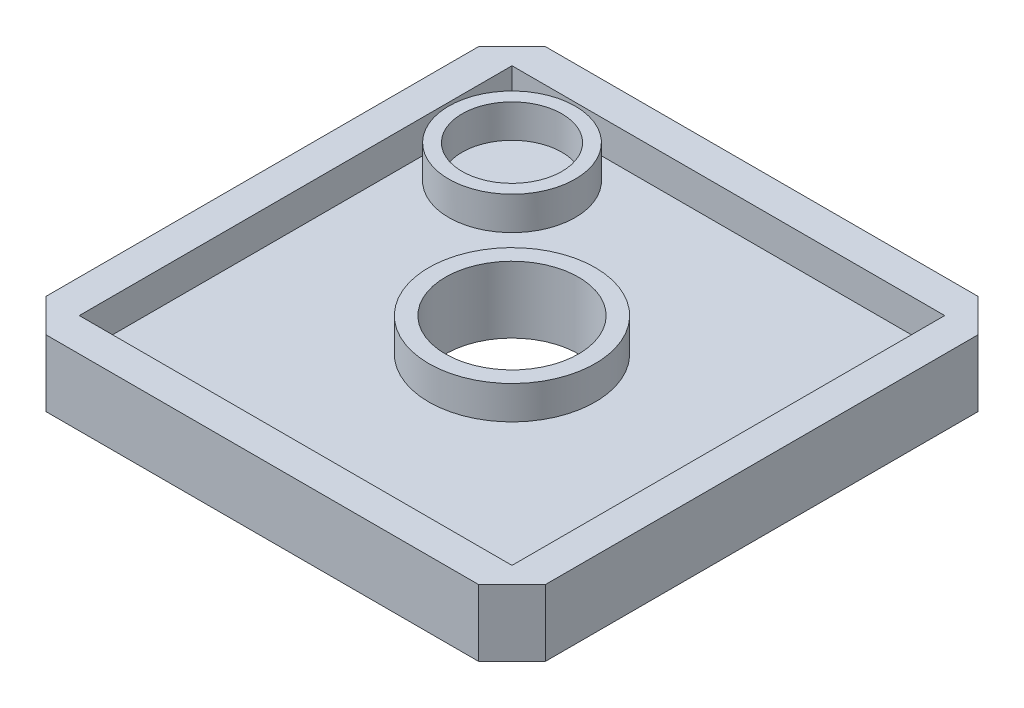
ISO-10303-21;
HEADER;
FILE_DESCRIPTION(('STEP AP214'),'2;1');
FILE_NAME('part.step','',(''),(''),'','','');
FILE_SCHEMA(('AUTOMOTIVE_DESIGN { 1 0 10303 214 1 1 1 1 }'));
ENDSEC;
DATA;
#1=APPLICATION_CONTEXT('core data for automotive mechanical design processes');
#2=APPLICATION_PROTOCOL_DEFINITION('international standard','automotive_design',2000,#1);
#3=PRODUCT_CONTEXT('',#1,'mechanical');
#4=PRODUCT('Part','Part','',(#3));
#5=PRODUCT_RELATED_PRODUCT_CATEGORY('part','',(#4));
#6=PRODUCT_DEFINITION_FORMATION('','',#4);
#7=PRODUCT_DEFINITION_CONTEXT('part definition',#1,'design');
#8=PRODUCT_DEFINITION('design','',#6,#7);
#9=PRODUCT_DEFINITION_SHAPE('','',#8);
#10=(LENGTH_UNIT() NAMED_UNIT(*) SI_UNIT(.MILLI.,.METRE.));
#11=(NAMED_UNIT(*) PLANE_ANGLE_UNIT() SI_UNIT($,.RADIAN.));
#12=(NAMED_UNIT(*) SI_UNIT($,.STERADIAN.) SOLID_ANGLE_UNIT());
#13=UNCERTAINTY_MEASURE_WITH_UNIT(LENGTH_MEASURE(1.E-05),#10,'distance_accuracy_value','');
#14=(GEOMETRIC_REPRESENTATION_CONTEXT(3) GLOBAL_UNCERTAINTY_ASSIGNED_CONTEXT((#13)) GLOBAL_UNIT_ASSIGNED_CONTEXT((#10,
#11,#12)) REPRESENTATION_CONTEXT('',''));
#15=CARTESIAN_POINT('',(0.,0.,0.));
#16=DIRECTION('',(0.,0.,1.));
#17=DIRECTION('',(1.,0.,0.));
#18=AXIS2_PLACEMENT_3D('',#15,#16,#17);
#19=CARTESIAN_POINT('',(0.,20.,0.));
#20=DIRECTION('',(0.,-1.,0.));
#21=DIRECTION('',(0.,0.,-1.));
#22=AXIS2_PLACEMENT_3D('',#19,#20,#21);
#23=PLANE('',#22);
#24=DIRECTION('',(0.,0.,-1.));
#25=VECTOR('',#24,1.);
#26=CARTESIAN_POINT('',(75.,20.,75.));
#27=LINE('',#26,#25);
#28=CARTESIAN_POINT('',(75.,20.,65.));
#29=VERTEX_POINT('',#28);
#30=CARTESIAN_POINT('',(75.,20.,-65.));
#31=VERTEX_POINT('',#30);
#32=EDGE_CURVE('E175',#29,#31,#27,.T.);
#33=ORIENTED_EDGE('',*,*,#32,.T.);
#34=DIRECTION('',(0.707106781186548,0.,0.707106781186547));
#35=VECTOR('',#34,1.);
#36=CARTESIAN_POINT('',(65.,20.,-75.));
#37=LINE('',#36,#35);
#38=CARTESIAN_POINT('',(65.,20.,-75.));
#39=VERTEX_POINT('',#38);
#40=EDGE_CURVE('E218',#31,#39,#37,.F.);
#41=ORIENTED_EDGE('',*,*,#40,.T.);
#42=DIRECTION('',(-1.,0.,0.));
#43=VECTOR('',#42,1.);
#44=CARTESIAN_POINT('',(-75.,20.,-75.));
#45=LINE('',#44,#43);
#46=CARTESIAN_POINT('',(-64.9999999999999,20.,-75.));
#47=VERTEX_POINT('',#46);
#48=EDGE_CURVE('E178',#39,#47,#45,.T.);
#49=ORIENTED_EDGE('',*,*,#48,.T.);
#50=DIRECTION('',(0.707106781186547,0.,-0.707106781186548));
#51=VECTOR('',#50,1.);
#52=CARTESIAN_POINT('',(-75.,20.,-65.));
#53=LINE('',#52,#51);
#54=CARTESIAN_POINT('',(-75.,20.,-65.));
#55=VERTEX_POINT('',#54);
#56=EDGE_CURVE('E216',#47,#55,#53,.F.);
#57=ORIENTED_EDGE('',*,*,#56,.T.);
#58=DIRECTION('',(0.,0.,1.));
#59=VECTOR('',#58,1.);
#60=CARTESIAN_POINT('',(-75.,20.,75.));
#61=LINE('',#60,#59);
#62=CARTESIAN_POINT('',(-75.,20.,65.));
#63=VERTEX_POINT('',#62);
#64=EDGE_CURVE('E182',#55,#63,#61,.T.);
#65=ORIENTED_EDGE('',*,*,#64,.T.);
#66=DIRECTION('',(-0.707106781186548,0.,-0.707106781186548));
#67=VECTOR('',#66,1.);
#68=CARTESIAN_POINT('',(-64.9999999999999,20.,75.));
#69=LINE('',#68,#67);
#70=CARTESIAN_POINT('',(-64.9999999999999,20.,75.));
#71=VERTEX_POINT('',#70);
#72=EDGE_CURVE('E63',#63,#71,#69,.F.);
#73=ORIENTED_EDGE('',*,*,#72,.T.);
#74=DIRECTION('',(1.,0.,0.));
#75=VECTOR('',#74,1.);
#76=CARTESIAN_POINT('',(-75.,20.,75.));
#77=LINE('',#76,#75);
#78=CARTESIAN_POINT('',(65.,20.,75.));
#79=VERTEX_POINT('',#78);
#80=EDGE_CURVE('E184',#71,#79,#77,.T.);
#81=ORIENTED_EDGE('',*,*,#80,.T.);
#82=DIRECTION('',(-0.707106781186548,0.,0.707106781186548));
#83=VECTOR('',#82,1.);
#84=CARTESIAN_POINT('',(75.,20.,65.));
#85=LINE('',#84,#83);
#86=EDGE_CURVE('E213',#79,#29,#85,.F.);
#87=ORIENTED_EDGE('',*,*,#86,.T.);
#88=EDGE_LOOP('',(#33,#41,#49,#57,#65,#73,#81,#87));
#89=FACE_BOUND('',#88,.T.);
#90=DIRECTION('',(0.,0.,1.));
#91=VECTOR('',#90,1.);
#92=CARTESIAN_POINT('',(-65.,20.,65.));
#93=LINE('',#92,#91);
#94=CARTESIAN_POINT('',(-65.,20.,-65.));
#95=VERTEX_POINT('',#94);
#96=CARTESIAN_POINT('',(-65.,20.,65.));
#97=VERTEX_POINT('',#96);
#98=EDGE_CURVE('E157',#95,#97,#93,.T.);
#99=ORIENTED_EDGE('',*,*,#98,.F.);
#100=DIRECTION('',(-1.,0.,0.));
#101=VECTOR('',#100,1.);
#102=CARTESIAN_POINT('',(-65.,20.,-65.));
#103=LINE('',#102,#101);
#104=CARTESIAN_POINT('',(65.,20.,-65.));
#105=VERTEX_POINT('',#104);
#106=EDGE_CURVE('E138',#105,#95,#103,.T.);
#107=ORIENTED_EDGE('',*,*,#106,.F.);
#108=DIRECTION('',(0.,0.,-1.));
#109=VECTOR('',#108,1.);
#110=CARTESIAN_POINT('',(65.0000000000001,20.,65.));
#111=LINE('',#110,#109);
#112=CARTESIAN_POINT('',(65.0000000000001,20.,65.));
#113=VERTEX_POINT('',#112);
#114=EDGE_CURVE('E165',#113,#105,#111,.T.);
#115=ORIENTED_EDGE('',*,*,#114,.F.);
#116=DIRECTION('',(1.,0.,0.));
#117=VECTOR('',#116,1.);
#118=CARTESIAN_POINT('',(-65.,20.,65.));
#119=LINE('',#118,#117);
#120=EDGE_CURVE('E159',#97,#113,#119,.T.);
#121=ORIENTED_EDGE('',*,*,#120,.F.);
#122=EDGE_LOOP('',(#99,#107,#115,#121));
#123=FACE_BOUND('',#122,.T.);
#124=ADVANCED_FACE('F40',(#89,#123),#23,.F.);
#125=CARTESIAN_POINT('',(0.,0.,0.));
#126=DIRECTION('',(0.,-1.,0.));
#127=DIRECTION('',(0.,0.,-1.));
#128=AXIS2_PLACEMENT_3D('',#125,#126,#127);
#129=PLANE('',#128);
#130=CARTESIAN_POINT('',(0.,0.,0.));
#131=DIRECTION('',(0.,1.,0.));
#132=DIRECTION('',(0.,0.,1.));
#133=AXIS2_PLACEMENT_3D('',#130,#131,#132);
#134=CIRCLE('',#133,20.);
#135=CARTESIAN_POINT('',(0.,0.,20.));
#136=VERTEX_POINT('',#135);
#137=EDGE_CURVE('E152',#136,#136,#134,.T.);
#138=ORIENTED_EDGE('',*,*,#137,.T.);
#139=EDGE_LOOP('',(#138));
#140=FACE_BOUND('',#139,.T.);
#141=DIRECTION('',(-1.,0.,0.));
#142=VECTOR('',#141,1.);
#143=CARTESIAN_POINT('',(-75.,0.,-75.));
#144=LINE('',#143,#142);
#145=CARTESIAN_POINT('',(65.,0.,-75.));
#146=VERTEX_POINT('',#145);
#147=CARTESIAN_POINT('',(-64.9999999999999,0.,-75.));
#148=VERTEX_POINT('',#147);
#149=EDGE_CURVE('E189',#146,#148,#144,.T.);
#150=ORIENTED_EDGE('',*,*,#149,.F.);
#151=DIRECTION('',(-0.707106781186548,0.,-0.707106781186547));
#152=VECTOR('',#151,1.);
#153=CARTESIAN_POINT('',(70.,0.,-70.0000000000001));
#154=LINE('',#153,#152);
#155=CARTESIAN_POINT('',(75.,0.,-65.));
#156=VERTEX_POINT('',#155);
#157=EDGE_CURVE('E206',#146,#156,#154,.F.);
#158=ORIENTED_EDGE('',*,*,#157,.T.);
#159=DIRECTION('',(0.,0.,-1.));
#160=VECTOR('',#159,1.);
#161=CARTESIAN_POINT('',(75.,0.,75.));
#162=LINE('',#161,#160);
#163=CARTESIAN_POINT('',(75.,0.,65.));
#164=VERTEX_POINT('',#163);
#165=EDGE_CURVE('E174',#164,#156,#162,.T.);
#166=ORIENTED_EDGE('',*,*,#165,.F.);
#167=DIRECTION('',(0.707106781186548,0.,-0.707106781186548));
#168=VECTOR('',#167,1.);
#169=CARTESIAN_POINT('',(70.,0.,70.));
#170=LINE('',#169,#168);
#171=CARTESIAN_POINT('',(65.,0.,75.));
#172=VERTEX_POINT('',#171);
#173=EDGE_CURVE('E200',#164,#172,#170,.F.);
#174=ORIENTED_EDGE('',*,*,#173,.T.);
#175=DIRECTION('',(1.,0.,0.));
#176=VECTOR('',#175,1.);
#177=CARTESIAN_POINT('',(-75.,0.,75.));
#178=LINE('',#177,#176);
#179=CARTESIAN_POINT('',(-64.9999999999999,0.,75.));
#180=VERTEX_POINT('',#179);
#181=EDGE_CURVE('E179',#180,#172,#178,.T.);
#182=ORIENTED_EDGE('',*,*,#181,.F.);
#183=DIRECTION('',(0.707106781186548,0.,0.707106781186548));
#184=VECTOR('',#183,1.);
#185=CARTESIAN_POINT('',(-70.,0.,70.));
#186=LINE('',#185,#184);
#187=CARTESIAN_POINT('',(-75.,0.,65.));
#188=VERTEX_POINT('',#187);
#189=EDGE_CURVE('E202',#180,#188,#186,.F.);
#190=ORIENTED_EDGE('',*,*,#189,.T.);
#191=DIRECTION('',(0.,0.,1.));
#192=VECTOR('',#191,1.);
#193=CARTESIAN_POINT('',(-75.,0.,75.));
#194=LINE('',#193,#192);
#195=CARTESIAN_POINT('',(-75.,0.,-65.));
#196=VERTEX_POINT('',#195);
#197=EDGE_CURVE('E192',#196,#188,#194,.T.);
#198=ORIENTED_EDGE('',*,*,#197,.F.);
#199=DIRECTION('',(-0.707106781186547,0.,0.707106781186548));
#200=VECTOR('',#199,1.);
#201=CARTESIAN_POINT('',(-70.,0.,-69.9999999999999));
#202=LINE('',#201,#200);
#203=EDGE_CURVE('E204',#196,#148,#202,.F.);
#204=ORIENTED_EDGE('',*,*,#203,.T.);
#205=EDGE_LOOP('',(#150,#158,#166,#174,#182,#190,#198,#204));
#206=FACE_BOUND('',#205,.T.);
#207=ADVANCED_FACE('F232',(#140,#206),#129,.T.);
#208=CARTESIAN_POINT('',(75.,20.,75.));
#209=DIRECTION('',(-1.,0.,0.));
#210=DIRECTION('',(0.,0.,1.));
#211=AXIS2_PLACEMENT_3D('',#208,#209,#210);
#212=PLANE('',#211);
#213=ORIENTED_EDGE('',*,*,#165,.T.);
#214=DIRECTION('',(0.,1.,0.));
#215=VECTOR('',#214,1.);
#216=CARTESIAN_POINT('',(75.,20.,-65.));
#217=LINE('',#216,#215);
#218=EDGE_CURVE('E211',#156,#31,#217,.T.);
#219=ORIENTED_EDGE('',*,*,#218,.T.);
#220=ORIENTED_EDGE('',*,*,#32,.F.);
#221=DIRECTION('',(0.,-1.,0.));
#222=VECTOR('',#221,1.);
#223=CARTESIAN_POINT('',(75.,20.,65.));
#224=LINE('',#223,#222);
#225=EDGE_CURVE('E208',#29,#164,#224,.T.);
#226=ORIENTED_EDGE('',*,*,#225,.T.);
#227=EDGE_LOOP('',(#213,#219,#220,#226));
#228=FACE_BOUND('',#227,.T.);
#229=ADVANCED_FACE('F240',(#228),#212,.F.);
#230=CARTESIAN_POINT('',(-75.,20.,-75.));
#231=DIRECTION('',(0.,0.,1.));
#232=DIRECTION('',(1.,0.,0.));
#233=AXIS2_PLACEMENT_3D('',#230,#231,#232);
#234=PLANE('',#233);
#235=ORIENTED_EDGE('',*,*,#48,.F.);
#236=DIRECTION('',(0.,-1.,0.));
#237=VECTOR('',#236,1.);
#238=CARTESIAN_POINT('',(65.,20.,-75.));
#239=LINE('',#238,#237);
#240=EDGE_CURVE('E197',#39,#146,#239,.T.);
#241=ORIENTED_EDGE('',*,*,#240,.T.);
#242=ORIENTED_EDGE('',*,*,#149,.T.);
#243=DIRECTION('',(0.,1.,0.));
#244=VECTOR('',#243,1.);
#245=CARTESIAN_POINT('',(-64.9999999999999,20.,-75.));
#246=LINE('',#245,#244);
#247=EDGE_CURVE('E186',#148,#47,#246,.T.);
#248=ORIENTED_EDGE('',*,*,#247,.T.);
#249=EDGE_LOOP('',(#235,#241,#242,#248));
#250=FACE_BOUND('',#249,.T.);
#251=ADVANCED_FACE('F249',(#250),#234,.F.);
#252=CARTESIAN_POINT('',(-75.,20.,75.));
#253=DIRECTION('',(1.,0.,0.));
#254=DIRECTION('',(0.,0.,-1.));
#255=AXIS2_PLACEMENT_3D('',#252,#253,#254);
#256=PLANE('',#255);
#257=ORIENTED_EDGE('',*,*,#64,.F.);
#258=DIRECTION('',(0.,-1.,0.));
#259=VECTOR('',#258,1.);
#260=CARTESIAN_POINT('',(-75.,20.,-65.));
#261=LINE('',#260,#259);
#262=EDGE_CURVE('E222',#55,#196,#261,.T.);
#263=ORIENTED_EDGE('',*,*,#262,.T.);
#264=ORIENTED_EDGE('',*,*,#197,.T.);
#265=DIRECTION('',(0.,1.,0.));
#266=VECTOR('',#265,1.);
#267=CARTESIAN_POINT('',(-75.,20.,65.));
#268=LINE('',#267,#266);
#269=EDGE_CURVE('E220',#188,#63,#268,.T.);
#270=ORIENTED_EDGE('',*,*,#269,.T.);
#271=EDGE_LOOP('',(#257,#263,#264,#270));
#272=FACE_BOUND('',#271,.T.);
#273=ADVANCED_FACE('F257',(#272),#256,.F.);
#274=CARTESIAN_POINT('',(-75.,20.,75.));
#275=DIRECTION('',(0.,0.,-1.));
#276=DIRECTION('',(-1.,0.,0.));
#277=AXIS2_PLACEMENT_3D('',#274,#275,#276);
#278=PLANE('',#277);
#279=ORIENTED_EDGE('',*,*,#80,.F.);
#280=DIRECTION('',(0.,-1.,0.));
#281=VECTOR('',#280,1.);
#282=CARTESIAN_POINT('',(-64.9999999999999,20.,75.));
#283=LINE('',#282,#281);
#284=EDGE_CURVE('E49',#71,#180,#283,.T.);
#285=ORIENTED_EDGE('',*,*,#284,.T.);
#286=ORIENTED_EDGE('',*,*,#181,.T.);
#287=DIRECTION('',(0.,1.,0.));
#288=VECTOR('',#287,1.);
#289=CARTESIAN_POINT('',(65.,20.,75.));
#290=LINE('',#289,#288);
#291=EDGE_CURVE('E56',#172,#79,#290,.T.);
#292=ORIENTED_EDGE('',*,*,#291,.T.);
#293=EDGE_LOOP('',(#279,#285,#286,#292));
#294=FACE_BOUND('',#293,.T.);
#295=ADVANCED_FACE('F228',(#294),#278,.F.);
#296=CARTESIAN_POINT('',(-65.,20.,65.));
#297=DIRECTION('',(1.,0.,0.));
#298=DIRECTION('',(0.,0.,-1.));
#299=AXIS2_PLACEMENT_3D('',#296,#297,#298);
#300=PLANE('',#299);
#301=DIRECTION('',(0.,0.,-1.));
#302=VECTOR('',#301,1.);
#303=CARTESIAN_POINT('',(-65.,10.,0.));
#304=LINE('',#303,#302);
#305=CARTESIAN_POINT('',(-65.,10.,65.));
#306=VERTEX_POINT('',#305);
#307=CARTESIAN_POINT('',(-65.,10.,-65.));
#308=VERTEX_POINT('',#307);
#309=EDGE_CURVE('E145',#306,#308,#304,.T.);
#310=ORIENTED_EDGE('',*,*,#309,.T.);
#311=DIRECTION('',(0.,-1.,0.));
#312=VECTOR('',#311,1.);
#313=CARTESIAN_POINT('',(-65.,20.,-65.));
#314=LINE('',#313,#312);
#315=EDGE_CURVE('E131',#95,#308,#314,.T.);
#316=ORIENTED_EDGE('',*,*,#315,.F.);
#317=ORIENTED_EDGE('',*,*,#98,.T.);
#318=DIRECTION('',(0.,-1.,0.));
#319=VECTOR('',#318,1.);
#320=CARTESIAN_POINT('',(-65.,20.,65.));
#321=LINE('',#320,#319);
#322=EDGE_CURVE('E148',#97,#306,#321,.T.);
#323=ORIENTED_EDGE('',*,*,#322,.T.);
#324=EDGE_LOOP('',(#310,#316,#317,#323));
#325=FACE_BOUND('',#324,.T.);
#326=ADVANCED_FACE('F146',(#325),#300,.T.);
#327=CARTESIAN_POINT('',(-65.,20.,65.));
#328=DIRECTION('',(0.,0.,-1.));
#329=DIRECTION('',(-1.,0.,0.));
#330=AXIS2_PLACEMENT_3D('',#327,#328,#329);
#331=PLANE('',#330);
#332=DIRECTION('',(1.,0.,0.));
#333=VECTOR('',#332,1.);
#334=CARTESIAN_POINT('',(0.,10.,65.));
#335=LINE('',#334,#333);
#336=CARTESIAN_POINT('',(65.0000000000001,10.,65.));
#337=VERTEX_POINT('',#336);
#338=EDGE_CURVE('E151',#306,#337,#335,.T.);
#339=ORIENTED_EDGE('',*,*,#338,.F.);
#340=ORIENTED_EDGE('',*,*,#322,.F.);
#341=ORIENTED_EDGE('',*,*,#120,.T.);
#342=DIRECTION('',(0.,-1.,0.));
#343=VECTOR('',#342,1.);
#344=CARTESIAN_POINT('',(65.0000000000001,20.,65.));
#345=LINE('',#344,#343);
#346=EDGE_CURVE('E170',#113,#337,#345,.T.);
#347=ORIENTED_EDGE('',*,*,#346,.T.);
#348=EDGE_LOOP('',(#339,#340,#341,#347));
#349=FACE_BOUND('',#348,.T.);
#350=ADVANCED_FACE('F362',(#349),#331,.T.);
#351=CARTESIAN_POINT('',(65.0000000000001,20.,65.));
#352=DIRECTION('',(-1.,0.,0.));
#353=DIRECTION('',(0.,0.,1.));
#354=AXIS2_PLACEMENT_3D('',#351,#352,#353);
#355=PLANE('',#354);
#356=DIRECTION('',(0.,0.,-1.));
#357=VECTOR('',#356,1.);
#358=CARTESIAN_POINT('',(65.0000000000001,10.,0.));
#359=LINE('',#358,#357);
#360=CARTESIAN_POINT('',(65.,10.,-65.));
#361=VERTEX_POINT('',#360);
#362=EDGE_CURVE('E156',#337,#361,#359,.T.);
#363=ORIENTED_EDGE('',*,*,#362,.F.);
#364=ORIENTED_EDGE('',*,*,#346,.F.);
#365=ORIENTED_EDGE('',*,*,#114,.T.);
#366=DIRECTION('',(0.,-1.,0.));
#367=VECTOR('',#366,1.);
#368=CARTESIAN_POINT('',(65.,20.,-65.));
#369=LINE('',#368,#367);
#370=EDGE_CURVE('E141',#105,#361,#369,.T.);
#371=ORIENTED_EDGE('',*,*,#370,.T.);
#372=EDGE_LOOP('',(#363,#364,#365,#371));
#373=FACE_BOUND('',#372,.T.);
#374=ADVANCED_FACE('F306',(#373),#355,.T.);
#375=CARTESIAN_POINT('',(-65.,20.,-65.));
#376=DIRECTION('',(0.,0.,1.));
#377=DIRECTION('',(1.,0.,0.));
#378=AXIS2_PLACEMENT_3D('',#375,#376,#377);
#379=PLANE('',#378);
#380=DIRECTION('',(1.,0.,0.));
#381=VECTOR('',#380,1.);
#382=CARTESIAN_POINT('',(0.,10.,-65.));
#383=LINE('',#382,#381);
#384=EDGE_CURVE('E135',#308,#361,#383,.T.);
#385=ORIENTED_EDGE('',*,*,#384,.T.);
#386=ORIENTED_EDGE('',*,*,#370,.F.);
#387=ORIENTED_EDGE('',*,*,#106,.T.);
#388=ORIENTED_EDGE('',*,*,#315,.T.);
#389=EDGE_LOOP('',(#385,#386,#387,#388));
#390=FACE_BOUND('',#389,.T.);
#391=ADVANCED_FACE('F133',(#390),#379,.T.);
#392=CARTESIAN_POINT('',(0.,10.,0.));
#393=DIRECTION('',(0.,1.,0.));
#394=DIRECTION('',(0.,0.,1.));
#395=AXIS2_PLACEMENT_3D('',#392,#393,#394);
#396=PLANE('',#395);
#397=CARTESIAN_POINT('',(-45.,10.,-45.));
#398=DIRECTION('',(0.,1.,0.));
#399=DIRECTION('',(0.,0.,1.));
#400=AXIS2_PLACEMENT_3D('',#397,#398,#399);
#401=CIRCLE('',#400,19.);
#402=CARTESIAN_POINT('',(-45.,10.,-26.));
#403=VERTEX_POINT('',#402);
#404=EDGE_CURVE('E499',#403,#403,#401,.T.);
#405=ORIENTED_EDGE('',*,*,#404,.F.);
#406=EDGE_LOOP('',(#405));
#407=FACE_BOUND('',#406,.T.);
#408=CARTESIAN_POINT('',(0.,10.,0.));
#409=DIRECTION('',(0.,1.,0.));
#410=DIRECTION('',(0.,0.,1.));
#411=AXIS2_PLACEMENT_3D('',#408,#409,#410);
#412=CIRCLE('',#411,25.);
#413=CARTESIAN_POINT('',(0.,10.,25.));
#414=VERTEX_POINT('',#413);
#415=EDGE_CURVE('E351',#414,#414,#412,.T.);
#416=ORIENTED_EDGE('',*,*,#415,.F.);
#417=EDGE_LOOP('',(#416));
#418=FACE_BOUND('',#417,.T.);
#419=ORIENTED_EDGE('',*,*,#309,.F.);
#420=ORIENTED_EDGE('',*,*,#338,.T.);
#421=ORIENTED_EDGE('',*,*,#362,.T.);
#422=ORIENTED_EDGE('',*,*,#384,.F.);
#423=EDGE_LOOP('',(#419,#420,#421,#422));
#424=FACE_BOUND('',#423,.T.);
#425=ADVANCED_FACE('F155',(#407,#418,#424),#396,.T.);
#426=CARTESIAN_POINT('',(65.,20.,-75.));
#427=DIRECTION('',(-0.707106781186547,0.,0.707106781186548));
#428=DIRECTION('',(0.,-1.,0.));
#429=AXIS2_PLACEMENT_3D('',#426,#427,#428);
#430=PLANE('',#429);
#431=ORIENTED_EDGE('',*,*,#40,.F.);
#432=ORIENTED_EDGE('',*,*,#218,.F.);
#433=ORIENTED_EDGE('',*,*,#157,.F.);
#434=ORIENTED_EDGE('',*,*,#240,.F.);
#435=EDGE_LOOP('',(#431,#432,#433,#434));
#436=FACE_BOUND('',#435,.T.);
#437=ADVANCED_FACE('F247',(#436),#430,.F.);
#438=CARTESIAN_POINT('',(-75.,20.,-65.));
#439=DIRECTION('',(0.707106781186548,0.,0.707106781186547));
#440=DIRECTION('',(0.,-1.,0.));
#441=AXIS2_PLACEMENT_3D('',#438,#439,#440);
#442=PLANE('',#441);
#443=ORIENTED_EDGE('',*,*,#56,.F.);
#444=ORIENTED_EDGE('',*,*,#247,.F.);
#445=ORIENTED_EDGE('',*,*,#203,.F.);
#446=ORIENTED_EDGE('',*,*,#262,.F.);
#447=EDGE_LOOP('',(#443,#444,#445,#446));
#448=FACE_BOUND('',#447,.T.);
#449=ADVANCED_FACE('F254',(#448),#442,.F.);
#450=CARTESIAN_POINT('',(-64.9999999999999,20.,75.));
#451=DIRECTION('',(0.707106781186547,0.,-0.707106781186547));
#452=DIRECTION('',(0.,-1.,0.));
#453=AXIS2_PLACEMENT_3D('',#450,#451,#452);
#454=PLANE('',#453);
#455=ORIENTED_EDGE('',*,*,#72,.F.);
#456=ORIENTED_EDGE('',*,*,#269,.F.);
#457=ORIENTED_EDGE('',*,*,#189,.F.);
#458=ORIENTED_EDGE('',*,*,#284,.F.);
#459=EDGE_LOOP('',(#455,#456,#457,#458));
#460=FACE_BOUND('',#459,.T.);
#461=ADVANCED_FACE('F259',(#460),#454,.F.);
#462=CARTESIAN_POINT('',(75.,20.,65.));
#463=DIRECTION('',(-0.707106781186547,0.,-0.707106781186547));
#464=DIRECTION('',(0.,-1.,0.));
#465=AXIS2_PLACEMENT_3D('',#462,#463,#464);
#466=PLANE('',#465);
#467=ORIENTED_EDGE('',*,*,#86,.F.);
#468=ORIENTED_EDGE('',*,*,#291,.F.);
#469=ORIENTED_EDGE('',*,*,#173,.F.);
#470=ORIENTED_EDGE('',*,*,#225,.F.);
#471=EDGE_LOOP('',(#467,#468,#469,#470));
#472=FACE_BOUND('',#471,.T.);
#473=ADVANCED_FACE('F43',(#472),#466,.F.);
#474=CARTESIAN_POINT('',(0.,0.,0.));
#475=DIRECTION('',(0.,1.,0.));
#476=DIRECTION('',(0.,0.,1.));
#477=AXIS2_PLACEMENT_3D('',#474,#475,#476);
#478=CYLINDRICAL_SURFACE('',#477,20.);
#479=ORIENTED_EDGE('',*,*,#137,.F.);
#480=EDGE_LOOP('',(#479));
#481=FACE_BOUND('',#480,.T.);
#482=CARTESIAN_POINT('',(0.,20.,0.));
#483=DIRECTION('',(0.,1.,0.));
#484=DIRECTION('',(0.,0.,1.));
#485=AXIS2_PLACEMENT_3D('',#482,#483,#484);
#486=CIRCLE('',#485,20.);
#487=CARTESIAN_POINT('',(0.,20.,20.));
#488=VERTEX_POINT('',#487);
#489=EDGE_CURVE('E349',#488,#488,#486,.F.);
#490=ORIENTED_EDGE('',*,*,#489,.F.);
#491=EDGE_LOOP('',(#490));
#492=FACE_BOUND('',#491,.T.);
#493=ADVANCED_FACE('F265',(#481,#492),#478,.F.);
#494=CARTESIAN_POINT('',(0.,20.,0.));
#495=DIRECTION('',(0.,-1.,0.));
#496=DIRECTION('',(0.,0.,-1.));
#497=AXIS2_PLACEMENT_3D('',#494,#495,#496);
#498=CYLINDRICAL_SURFACE('',#497,25.);
#499=CARTESIAN_POINT('',(0.,20.,0.));
#500=DIRECTION('',(0.,1.,0.));
#501=DIRECTION('',(0.,0.,1.));
#502=AXIS2_PLACEMENT_3D('',#499,#500,#501);
#503=CIRCLE('',#502,25.);
#504=CARTESIAN_POINT('',(0.,20.,25.));
#505=VERTEX_POINT('',#504);
#506=EDGE_CURVE('E350',#505,#505,#503,.T.);
#507=ORIENTED_EDGE('',*,*,#506,.F.);
#508=EDGE_LOOP('',(#507));
#509=FACE_BOUND('',#508,.T.);
#510=ORIENTED_EDGE('',*,*,#415,.T.);
#511=EDGE_LOOP('',(#510));
#512=FACE_BOUND('',#511,.T.);
#513=ADVANCED_FACE('F336',(#509,#512),#498,.T.);
#514=CARTESIAN_POINT('',(0.,20.,0.));
#515=DIRECTION('',(0.,1.,0.));
#516=DIRECTION('',(0.,0.,1.));
#517=AXIS2_PLACEMENT_3D('',#514,#515,#516);
#518=PLANE('',#517);
#519=ORIENTED_EDGE('',*,*,#489,.T.);
#520=EDGE_LOOP('',(#519));
#521=FACE_BOUND('',#520,.T.);
#522=ORIENTED_EDGE('',*,*,#506,.T.);
#523=EDGE_LOOP('',(#522));
#524=FACE_BOUND('',#523,.T.);
#525=ADVANCED_FACE('F329',(#521,#524),#518,.T.);
#526=CARTESIAN_POINT('',(-45.,73.7401153701776,-45.));
#527=DIRECTION('',(0.,-1.,0.));
#528=DIRECTION('',(0.,0.,-1.));
#529=AXIS2_PLACEMENT_3D('',#526,#527,#528);
#530=CYLINDRICAL_SURFACE('',#529,19.);
#531=CARTESIAN_POINT('',(-45.,20.,-45.));
#532=DIRECTION('',(0.,-1.,0.));
#533=DIRECTION('',(0.,0.,-1.));
#534=AXIS2_PLACEMENT_3D('',#531,#532,#533);
#535=CIRCLE('',#534,19.);
#536=CARTESIAN_POINT('',(-45.,20.,-64.));
#537=VERTEX_POINT('',#536);
#538=EDGE_CURVE('E500',#537,#537,#535,.T.);
#539=ORIENTED_EDGE('',*,*,#538,.T.);
#540=EDGE_LOOP('',(#539));
#541=FACE_BOUND('',#540,.T.);
#542=ORIENTED_EDGE('',*,*,#404,.T.);
#543=EDGE_LOOP('',(#542));
#544=FACE_BOUND('',#543,.T.);
#545=ADVANCED_FACE('F323',(#541,#544),#530,.T.);
#546=CARTESIAN_POINT('',(-45.,73.7401153701776,-45.));
#547=DIRECTION('',(0.,-1.,0.));
#548=DIRECTION('',(0.,0.,-1.));
#549=AXIS2_PLACEMENT_3D('',#546,#547,#548);
#550=CYLINDRICAL_SURFACE('',#549,15.);
#551=CARTESIAN_POINT('',(-45.,20.,-45.));
#552=DIRECTION('',(0.,-1.,0.));
#553=DIRECTION('',(0.,0.,-1.));
#554=AXIS2_PLACEMENT_3D('',#551,#552,#553);
#555=CIRCLE('',#554,15.);
#556=CARTESIAN_POINT('',(-45.,20.,-60.));
#557=VERTEX_POINT('',#556);
#558=EDGE_CURVE('E356',#557,#557,#555,.T.);
#559=ORIENTED_EDGE('',*,*,#558,.F.);
#560=EDGE_LOOP('',(#559));
#561=FACE_BOUND('',#560,.T.);
#562=CARTESIAN_POINT('',(-45.,9.99999999999999,-45.));
#563=DIRECTION('',(0.,1.,0.));
#564=DIRECTION('',(0.,0.,1.));
#565=AXIS2_PLACEMENT_3D('',#562,#563,#564);
#566=CIRCLE('',#565,15.);
#567=CARTESIAN_POINT('',(-45.,9.99999999999999,-30.));
#568=VERTEX_POINT('',#567);
#569=EDGE_CURVE('E11',#568,#568,#566,.F.);
#570=ORIENTED_EDGE('',*,*,#569,.T.);
#571=EDGE_LOOP('',(#570));
#572=FACE_BOUND('',#571,.T.);
#573=ADVANCED_FACE('F317',(#561,#572),#550,.F.);
#574=CARTESIAN_POINT('',(0.,20.,0.));
#575=DIRECTION('',(0.,-1.,0.));
#576=DIRECTION('',(0.,0.,-1.));
#577=AXIS2_PLACEMENT_3D('',#574,#575,#576);
#578=PLANE('',#577);
#579=ORIENTED_EDGE('',*,*,#558,.T.);
#580=EDGE_LOOP('',(#579));
#581=FACE_BOUND('',#580,.T.);
#582=ORIENTED_EDGE('',*,*,#538,.F.);
#583=EDGE_LOOP('',(#582));
#584=FACE_BOUND('',#583,.T.);
#585=ADVANCED_FACE('F312',(#581,#584),#578,.F.);
#586=ORIENTED_EDGE('',*,*,#569,.F.);
#587=EDGE_LOOP('',(#586));
#588=FACE_BOUND('',#587,.T.);
#589=ADVANCED_FACE('F302',(#588),#396,.T.);
#590=CLOSED_SHELL('',(#124,#207,#229,#251,#273,#295,#326,#350,#374,#391,#425,#437,#449,#461,
#473,#493,#513,#525,#545,#573,#585,#589));
#591=MANIFOLD_SOLID_BREP('B2',#590);
#592=ADVANCED_BREP_SHAPE_REPRESENTATION('',(#18,#591),#14);
#593=SHAPE_DEFINITION_REPRESENTATION(#9,#592);
ENDSEC;
END-ISO-10303-21;
